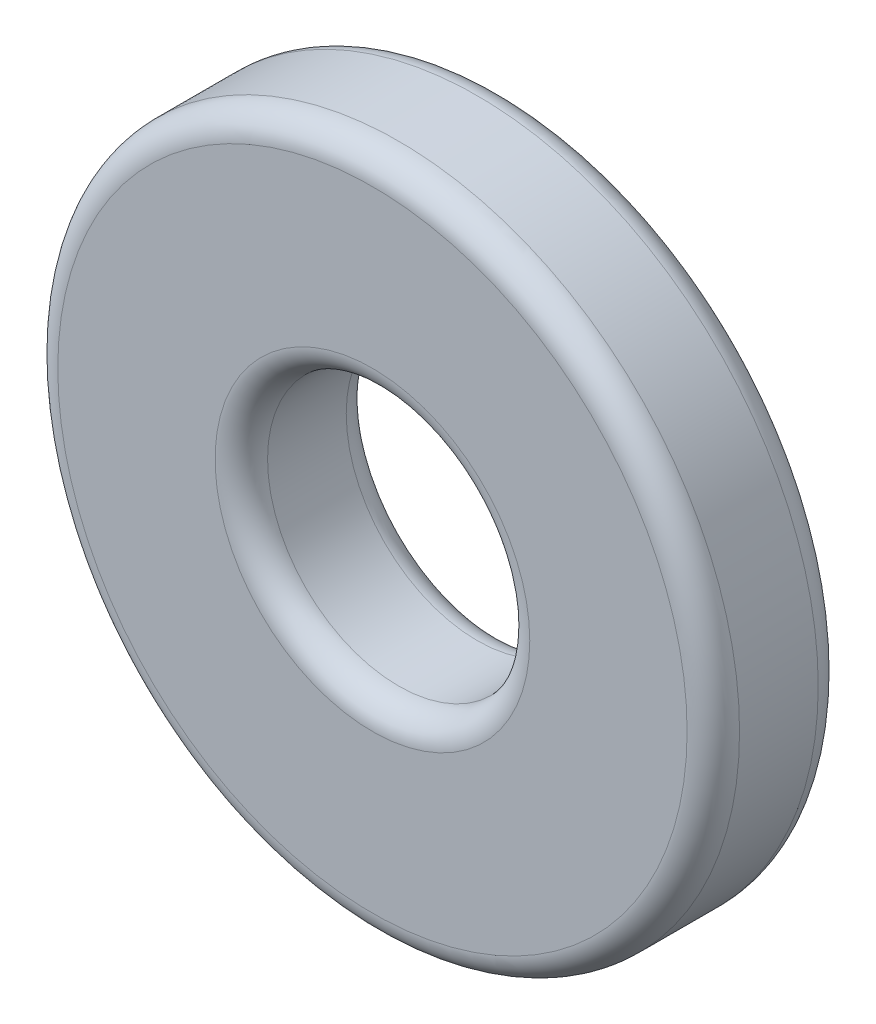
ISO-10303-21;
HEADER;
FILE_DESCRIPTION(('STEP AP214'),'2;1');
FILE_NAME('part.step','',(''),(''),'','','');
FILE_SCHEMA(('AUTOMOTIVE_DESIGN { 1 0 10303 214 1 1 1 1 }'));
ENDSEC;
DATA;
#1=APPLICATION_CONTEXT('core data for automotive mechanical design processes');
#2=APPLICATION_PROTOCOL_DEFINITION('international standard','automotive_design',2000,#1);
#3=PRODUCT_CONTEXT('',#1,'mechanical');
#4=PRODUCT('Part','Part','',(#3));
#5=PRODUCT_RELATED_PRODUCT_CATEGORY('part','',(#4));
#6=PRODUCT_DEFINITION_FORMATION('','',#4);
#7=PRODUCT_DEFINITION_CONTEXT('part definition',#1,'design');
#8=PRODUCT_DEFINITION('design','',#6,#7);
#9=PRODUCT_DEFINITION_SHAPE('','',#8);
#10=(LENGTH_UNIT() NAMED_UNIT(*) SI_UNIT(.MILLI.,.METRE.));
#11=(NAMED_UNIT(*) PLANE_ANGLE_UNIT() SI_UNIT($,.RADIAN.));
#12=(NAMED_UNIT(*) SI_UNIT($,.STERADIAN.) SOLID_ANGLE_UNIT());
#13=UNCERTAINTY_MEASURE_WITH_UNIT(LENGTH_MEASURE(1.E-05),#10,'distance_accuracy_value','');
#14=(GEOMETRIC_REPRESENTATION_CONTEXT(3) GLOBAL_UNCERTAINTY_ASSIGNED_CONTEXT((#13)) GLOBAL_UNIT_ASSIGNED_CONTEXT((#10,
#11,#12)) REPRESENTATION_CONTEXT('',''));
#15=CARTESIAN_POINT('',(0.,0.,0.));
#16=DIRECTION('',(0.,0.,1.));
#17=DIRECTION('',(1.,0.,0.));
#18=AXIS2_PLACEMENT_3D('',#15,#16,#17);
#19=CARTESIAN_POINT('',(0.,0.,5.));
#20=DIRECTION('',(0.,0.,-1.));
#21=DIRECTION('',(-1.,0.,0.));
#22=AXIS2_PLACEMENT_3D('',#19,#20,#21);
#23=CYLINDRICAL_SURFACE('',#22,13.);
#24=CARTESIAN_POINT('',(0.,0.,1.));
#25=DIRECTION('',(0.,0.,1.));
#26=DIRECTION('',(1.,0.,0.));
#27=AXIS2_PLACEMENT_3D('',#24,#25,#26);
#28=CIRCLE('',#27,13.);
#29=CARTESIAN_POINT('',(13.,0.,1.));
#30=VERTEX_POINT('',#29);
#31=EDGE_CURVE('E10',#30,#30,#28,.T.);
#32=ORIENTED_EDGE('',*,*,#31,.T.);
#33=EDGE_LOOP('',(#32));
#34=FACE_BOUND('',#33,.T.);
#35=CARTESIAN_POINT('',(0.,0.,4.));
#36=DIRECTION('',(0.,0.,1.));
#37=DIRECTION('',(1.,0.,0.));
#38=AXIS2_PLACEMENT_3D('',#35,#36,#37);
#39=CIRCLE('',#38,13.);
#40=CARTESIAN_POINT('',(13.,0.,4.));
#41=VERTEX_POINT('',#40);
#42=EDGE_CURVE('E44',#41,#41,#39,.F.);
#43=ORIENTED_EDGE('',*,*,#42,.T.);
#44=EDGE_LOOP('',(#43));
#45=FACE_BOUND('',#44,.T.);
#46=ADVANCED_FACE('F37',(#34,#45),#23,.T.);
#47=CARTESIAN_POINT('',(0.,0.,5.));
#48=DIRECTION('',(0.,0.,1.));
#49=DIRECTION('',(1.,0.,0.));
#50=AXIS2_PLACEMENT_3D('',#47,#48,#49);
#51=PLANE('',#50);
#52=CARTESIAN_POINT('',(0.,0.,5.));
#53=DIRECTION('',(0.,0.,1.));
#54=DIRECTION('',(1.,0.,0.));
#55=AXIS2_PLACEMENT_3D('',#52,#53,#54);
#56=CIRCLE('',#55,6.);
#57=CARTESIAN_POINT('',(6.,0.,5.));
#58=VERTEX_POINT('',#57);
#59=EDGE_CURVE('E57',#58,#58,#56,.F.);
#60=ORIENTED_EDGE('',*,*,#59,.T.);
#61=EDGE_LOOP('',(#60));
#62=FACE_BOUND('',#61,.T.);
#63=CARTESIAN_POINT('',(0.,0.,5.));
#64=DIRECTION('',(0.,0.,1.));
#65=DIRECTION('',(1.,0.,0.));
#66=AXIS2_PLACEMENT_3D('',#63,#64,#65);
#67=CIRCLE('',#66,12.);
#68=CARTESIAN_POINT('',(12.,0.,5.));
#69=VERTEX_POINT('',#68);
#70=EDGE_CURVE('E60',#69,#69,#67,.T.);
#71=ORIENTED_EDGE('',*,*,#70,.T.);
#72=EDGE_LOOP('',(#71));
#73=FACE_BOUND('',#72,.T.);
#74=ADVANCED_FACE('F83',(#62,#73),#51,.T.);
#75=CARTESIAN_POINT('',(0.,0.,0.));
#76=DIRECTION('',(0.,0.,1.));
#77=DIRECTION('',(1.,0.,0.));
#78=AXIS2_PLACEMENT_3D('',#75,#76,#77);
#79=PLANE('',#78);
#80=CARTESIAN_POINT('',(0.,0.,0.));
#81=DIRECTION('',(0.,0.,1.));
#82=DIRECTION('',(1.,0.,0.));
#83=AXIS2_PLACEMENT_3D('',#80,#81,#82);
#84=CIRCLE('',#83,6.);
#85=CARTESIAN_POINT('',(6.,0.,0.));
#86=VERTEX_POINT('',#85);
#87=EDGE_CURVE('E48',#86,#86,#84,.T.);
#88=ORIENTED_EDGE('',*,*,#87,.T.);
#89=EDGE_LOOP('',(#88));
#90=FACE_BOUND('',#89,.T.);
#91=CARTESIAN_POINT('',(0.,0.,0.));
#92=DIRECTION('',(0.,0.,1.));
#93=DIRECTION('',(1.,0.,0.));
#94=AXIS2_PLACEMENT_3D('',#91,#92,#93);
#95=CIRCLE('',#94,12.);
#96=CARTESIAN_POINT('',(12.,0.,0.));
#97=VERTEX_POINT('',#96);
#98=EDGE_CURVE('E52',#97,#97,#95,.F.);
#99=ORIENTED_EDGE('',*,*,#98,.T.);
#100=EDGE_LOOP('',(#99));
#101=FACE_BOUND('',#100,.T.);
#102=ADVANCED_FACE('F80',(#90,#101),#79,.F.);
#103=CARTESIAN_POINT('',(0.,0.,0.));
#104=DIRECTION('',(0.,0.,1.));
#105=DIRECTION('',(1.,0.,0.));
#106=AXIS2_PLACEMENT_3D('',#103,#104,#105);
#107=CYLINDRICAL_SURFACE('',#106,5.);
#108=CARTESIAN_POINT('',(0.,0.,4.));
#109=DIRECTION('',(0.,0.,1.));
#110=DIRECTION('',(1.,0.,0.));
#111=AXIS2_PLACEMENT_3D('',#108,#109,#110);
#112=CIRCLE('',#111,5.);
#113=CARTESIAN_POINT('',(5.,0.,4.));
#114=VERTEX_POINT('',#113);
#115=EDGE_CURVE('E63',#114,#114,#112,.T.);
#116=ORIENTED_EDGE('',*,*,#115,.T.);
#117=EDGE_LOOP('',(#116));
#118=FACE_BOUND('',#117,.T.);
#119=CARTESIAN_POINT('',(0.,0.,1.));
#120=DIRECTION('',(0.,0.,1.));
#121=DIRECTION('',(1.,0.,0.));
#122=AXIS2_PLACEMENT_3D('',#119,#120,#121);
#123=CIRCLE('',#122,5.);
#124=CARTESIAN_POINT('',(5.,0.,1.));
#125=VERTEX_POINT('',#124);
#126=EDGE_CURVE('E66',#125,#125,#123,.F.);
#127=ORIENTED_EDGE('',*,*,#126,.T.);
#128=EDGE_LOOP('',(#127));
#129=FACE_BOUND('',#128,.T.);
#130=ADVANCED_FACE('F70',(#118,#129),#107,.F.);
#131=CARTESIAN_POINT('',(0.,0.,4.));
#132=DIRECTION('',(0.,0.,1.));
#133=DIRECTION('',(1.,0.,0.));
#134=AXIS2_PLACEMENT_3D('',#131,#132,#133);
#135=TOROIDAL_SURFACE('',#134,6.,1.);
#136=ORIENTED_EDGE('',*,*,#59,.F.);
#137=EDGE_LOOP('',(#136));
#138=FACE_BOUND('',#137,.T.);
#139=ORIENTED_EDGE('',*,*,#115,.F.);
#140=EDGE_LOOP('',(#139));
#141=FACE_BOUND('',#140,.T.);
#142=ADVANCED_FACE('F76',(#138,#141),#135,.T.);
#143=CARTESIAN_POINT('',(0.,0.,1.));
#144=DIRECTION('',(0.,0.,1.));
#145=DIRECTION('',(1.,0.,0.));
#146=AXIS2_PLACEMENT_3D('',#143,#144,#145);
#147=TOROIDAL_SURFACE('',#146,6.,1.);
#148=ORIENTED_EDGE('',*,*,#126,.F.);
#149=EDGE_LOOP('',(#148));
#150=FACE_BOUND('',#149,.T.);
#151=ORIENTED_EDGE('',*,*,#87,.F.);
#152=EDGE_LOOP('',(#151));
#153=FACE_BOUND('',#152,.T.);
#154=ADVANCED_FACE('F72',(#150,#153),#147,.T.);
#155=CARTESIAN_POINT('',(0.,0.,1.));
#156=DIRECTION('',(0.,0.,1.));
#157=DIRECTION('',(1.,0.,0.));
#158=AXIS2_PLACEMENT_3D('',#155,#156,#157);
#159=TOROIDAL_SURFACE('',#158,12.,1.);
#160=ORIENTED_EDGE('',*,*,#98,.F.);
#161=EDGE_LOOP('',(#160));
#162=FACE_BOUND('',#161,.T.);
#163=ORIENTED_EDGE('',*,*,#31,.F.);
#164=EDGE_LOOP('',(#163));
#165=FACE_BOUND('',#164,.T.);
#166=ADVANCED_FACE('F75',(#162,#165),#159,.T.);
#167=CARTESIAN_POINT('',(0.,0.,4.));
#168=DIRECTION('',(0.,0.,1.));
#169=DIRECTION('',(1.,0.,0.));
#170=AXIS2_PLACEMENT_3D('',#167,#168,#169);
#171=TOROIDAL_SURFACE('',#170,12.,1.);
#172=ORIENTED_EDGE('',*,*,#42,.F.);
#173=EDGE_LOOP('',(#172));
#174=FACE_BOUND('',#173,.T.);
#175=ORIENTED_EDGE('',*,*,#70,.F.);
#176=EDGE_LOOP('',(#175));
#177=FACE_BOUND('',#176,.T.);
#178=ADVANCED_FACE('F39',(#174,#177),#171,.T.);
#179=CLOSED_SHELL('',(#46,#74,#102,#130,#142,#154,#166,#178));
#180=MANIFOLD_SOLID_BREP('B2',#179);
#181=ADVANCED_BREP_SHAPE_REPRESENTATION('',(#18,#180),#14);
#182=SHAPE_DEFINITION_REPRESENTATION(#9,#181);
ENDSEC;
END-ISO-10303-21;
